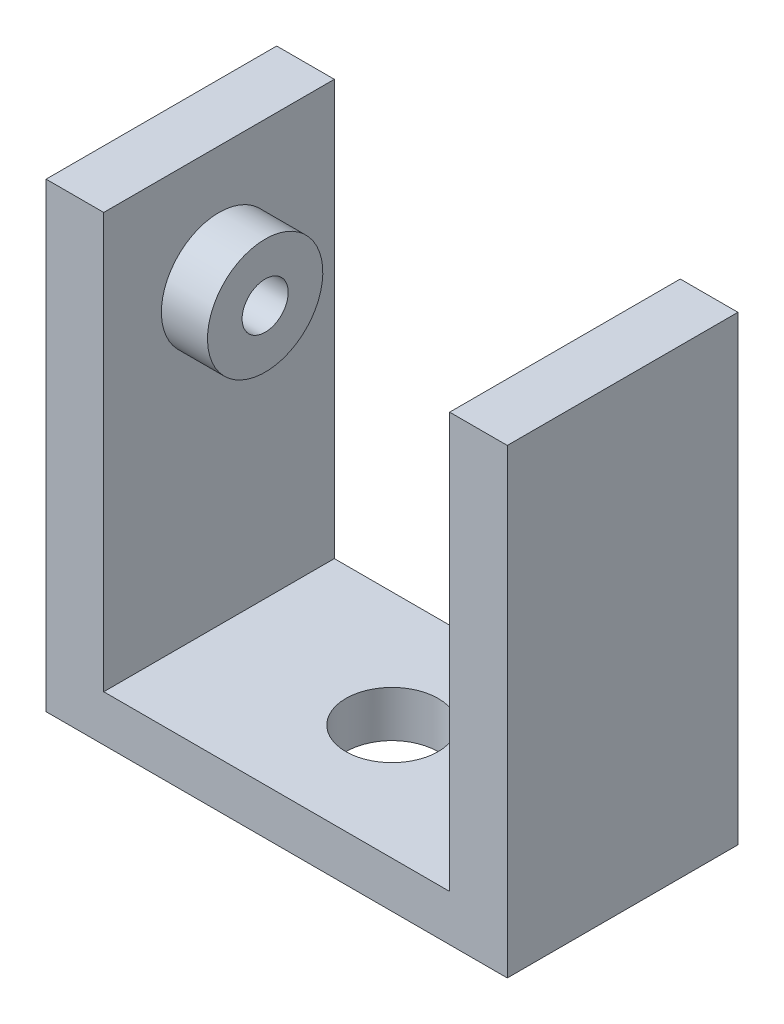
ISO-10303-21;
HEADER;
FILE_DESCRIPTION(('STEP AP214'),'2;1');
FILE_NAME('part.step','',(''),(''),'','','');
FILE_SCHEMA(('AUTOMOTIVE_DESIGN { 1 0 10303 214 1 1 1 1 }'));
ENDSEC;
DATA;
#1=APPLICATION_CONTEXT('core data for automotive mechanical design processes');
#2=APPLICATION_PROTOCOL_DEFINITION('international standard','automotive_design',2000,#1);
#3=PRODUCT_CONTEXT('',#1,'mechanical');
#4=PRODUCT('Part','Part','',(#3));
#5=PRODUCT_RELATED_PRODUCT_CATEGORY('part','',(#4));
#6=PRODUCT_DEFINITION_FORMATION('','',#4);
#7=PRODUCT_DEFINITION_CONTEXT('part definition',#1,'design');
#8=PRODUCT_DEFINITION('design','',#6,#7);
#9=PRODUCT_DEFINITION_SHAPE('','',#8);
#10=(LENGTH_UNIT() NAMED_UNIT(*) SI_UNIT(.MILLI.,.METRE.));
#11=(NAMED_UNIT(*) PLANE_ANGLE_UNIT() SI_UNIT($,.RADIAN.));
#12=(NAMED_UNIT(*) SI_UNIT($,.STERADIAN.) SOLID_ANGLE_UNIT());
#13=UNCERTAINTY_MEASURE_WITH_UNIT(LENGTH_MEASURE(1.E-05),#10,'distance_accuracy_value','');
#14=(GEOMETRIC_REPRESENTATION_CONTEXT(3) GLOBAL_UNCERTAINTY_ASSIGNED_CONTEXT((#13)) GLOBAL_UNIT_ASSIGNED_CONTEXT((#10,
#11,#12)) REPRESENTATION_CONTEXT('',''));
#15=CARTESIAN_POINT('',(0.,0.,0.));
#16=DIRECTION('',(0.,0.,1.));
#17=DIRECTION('',(1.,0.,0.));
#18=AXIS2_PLACEMENT_3D('',#15,#16,#17);
#19=CARTESIAN_POINT('',(0.,40.,0.));
#20=DIRECTION('',(0.,1.,0.));
#21=DIRECTION('',(0.,0.,1.));
#22=AXIS2_PLACEMENT_3D('',#19,#20,#21);
#23=PLANE('',#22);
#24=DIRECTION('',(1.,0.,0.));
#25=VECTOR('',#24,1.);
#26=CARTESIAN_POINT('',(-20.,40.,10.));
#27=LINE('',#26,#25);
#28=CARTESIAN_POINT('',(-20.,40.,10.));
#29=VERTEX_POINT('',#28);
#30=CARTESIAN_POINT('',(-15.,40.,10.));
#31=VERTEX_POINT('',#30);
#32=EDGE_CURVE('E115',#29,#31,#27,.T.);
#33=ORIENTED_EDGE('',*,*,#32,.T.);
#34=DIRECTION('',(0.,0.,-1.));
#35=VECTOR('',#34,1.);
#36=CARTESIAN_POINT('',(-15.,40.,110.));
#37=LINE('',#36,#35);
#38=CARTESIAN_POINT('',(-15.,40.,-10.));
#39=VERTEX_POINT('',#38);
#40=EDGE_CURVE('E368',#31,#39,#37,.T.);
#41=ORIENTED_EDGE('',*,*,#40,.T.);
#42=DIRECTION('',(-1.,0.,0.));
#43=VECTOR('',#42,1.);
#44=CARTESIAN_POINT('',(-20.,40.,-10.));
#45=LINE('',#44,#43);
#46=CARTESIAN_POINT('',(-20.,40.,-10.));
#47=VERTEX_POINT('',#46);
#48=EDGE_CURVE('E382',#39,#47,#45,.T.);
#49=ORIENTED_EDGE('',*,*,#48,.T.);
#50=DIRECTION('',(0.,0.,1.));
#51=VECTOR('',#50,1.);
#52=CARTESIAN_POINT('',(-20.,40.,-10.));
#53=LINE('',#52,#51);
#54=EDGE_CURVE('E116',#47,#29,#53,.T.);
#55=ORIENTED_EDGE('',*,*,#54,.T.);
#56=EDGE_LOOP('',(#33,#41,#49,#55));
#57=FACE_BOUND('',#56,.T.);
#58=ADVANCED_FACE('F39',(#57),#23,.T.);
#59=CARTESIAN_POINT('',(-20.,40.,-10.));
#60=DIRECTION('',(0.,0.,1.));
#61=DIRECTION('',(1.,0.,0.));
#62=AXIS2_PLACEMENT_3D('',#59,#60,#61);
#63=PLANE('',#62);
#64=DIRECTION('',(0.,1.,0.));
#65=VECTOR('',#64,1.);
#66=CARTESIAN_POINT('',(-15.,40.,-10.));
#67=LINE('',#66,#65);
#68=CARTESIAN_POINT('',(-15.,4.,-10.));
#69=VERTEX_POINT('',#68);
#70=EDGE_CURVE('E55',#69,#39,#67,.T.);
#71=ORIENTED_EDGE('',*,*,#70,.F.);
#72=DIRECTION('',(-1.,0.,0.));
#73=VECTOR('',#72,1.);
#74=CARTESIAN_POINT('',(-20.,4.,-10.));
#75=LINE('',#74,#73);
#76=CARTESIAN_POINT('',(15.,4.,-10.));
#77=VERTEX_POINT('',#76);
#78=EDGE_CURVE('E59',#77,#69,#75,.T.);
#79=ORIENTED_EDGE('',*,*,#78,.F.);
#80=DIRECTION('',(0.,-1.,0.));
#81=VECTOR('',#80,1.);
#82=CARTESIAN_POINT('',(15.,40.,-10.));
#83=LINE('',#82,#81);
#84=CARTESIAN_POINT('',(15.,40.,-10.));
#85=VERTEX_POINT('',#84);
#86=EDGE_CURVE('E371',#85,#77,#83,.T.);
#87=ORIENTED_EDGE('',*,*,#86,.F.);
#88=CARTESIAN_POINT('',(20.,40.,-10.));
#89=VERTEX_POINT('',#88);
#90=EDGE_CURVE('E122',#89,#85,#45,.T.);
#91=ORIENTED_EDGE('',*,*,#90,.F.);
#92=DIRECTION('',(0.,-1.,0.));
#93=VECTOR('',#92,1.);
#94=CARTESIAN_POINT('',(20.,40.,-10.));
#95=LINE('',#94,#93);
#96=CARTESIAN_POINT('',(20.,0.,-10.));
#97=VERTEX_POINT('',#96);
#98=EDGE_CURVE('E133',#89,#97,#95,.T.);
#99=ORIENTED_EDGE('',*,*,#98,.T.);
#100=DIRECTION('',(-1.,0.,0.));
#101=VECTOR('',#100,1.);
#102=CARTESIAN_POINT('',(-20.,0.,-10.));
#103=LINE('',#102,#101);
#104=CARTESIAN_POINT('',(-20.,0.,-10.));
#105=VERTEX_POINT('',#104);
#106=EDGE_CURVE('E392',#97,#105,#103,.T.);
#107=ORIENTED_EDGE('',*,*,#106,.T.);
#108=DIRECTION('',(0.,-1.,0.));
#109=VECTOR('',#108,1.);
#110=CARTESIAN_POINT('',(-20.,40.,-10.));
#111=LINE('',#110,#109);
#112=EDGE_CURVE('E140',#47,#105,#111,.T.);
#113=ORIENTED_EDGE('',*,*,#112,.F.);
#114=ORIENTED_EDGE('',*,*,#48,.F.);
#115=EDGE_LOOP('',(#71,#79,#87,#91,#99,#107,#113,#114));
#116=FACE_BOUND('',#115,.T.);
#117=ADVANCED_FACE('F179',(#116),#63,.F.);
#118=CARTESIAN_POINT('',(-20.,40.,10.));
#119=DIRECTION('',(0.,0.,-1.));
#120=DIRECTION('',(-1.,0.,0.));
#121=AXIS2_PLACEMENT_3D('',#118,#119,#120);
#122=PLANE('',#121);
#123=DIRECTION('',(0.,-1.,0.));
#124=VECTOR('',#123,1.);
#125=CARTESIAN_POINT('',(-15.,40.,10.));
#126=LINE('',#125,#124);
#127=CARTESIAN_POINT('',(-15.,4.,10.));
#128=VERTEX_POINT('',#127);
#129=EDGE_CURVE('E137',#31,#128,#126,.T.);
#130=ORIENTED_EDGE('',*,*,#129,.F.);
#131=ORIENTED_EDGE('',*,*,#32,.F.);
#132=DIRECTION('',(0.,-1.,0.));
#133=VECTOR('',#132,1.);
#134=CARTESIAN_POINT('',(-20.,40.,10.));
#135=LINE('',#134,#133);
#136=CARTESIAN_POINT('',(-20.,0.,10.));
#137=VERTEX_POINT('',#136);
#138=EDGE_CURVE('E402',#29,#137,#135,.T.);
#139=ORIENTED_EDGE('',*,*,#138,.T.);
#140=DIRECTION('',(1.,0.,0.));
#141=VECTOR('',#140,1.);
#142=CARTESIAN_POINT('',(-20.,0.,10.));
#143=LINE('',#142,#141);
#144=CARTESIAN_POINT('',(20.,0.,10.));
#145=VERTEX_POINT('',#144);
#146=EDGE_CURVE('E383',#137,#145,#143,.T.);
#147=ORIENTED_EDGE('',*,*,#146,.T.);
#148=DIRECTION('',(0.,-1.,0.));
#149=VECTOR('',#148,1.);
#150=CARTESIAN_POINT('',(20.,40.,10.));
#151=LINE('',#150,#149);
#152=CARTESIAN_POINT('',(20.,40.,10.));
#153=VERTEX_POINT('',#152);
#154=EDGE_CURVE('E110',#153,#145,#151,.T.);
#155=ORIENTED_EDGE('',*,*,#154,.F.);
#156=CARTESIAN_POINT('',(15.,40.,9.99999999999999));
#157=VERTEX_POINT('',#156);
#158=EDGE_CURVE('E103',#157,#153,#27,.T.);
#159=ORIENTED_EDGE('',*,*,#158,.F.);
#160=DIRECTION('',(0.,1.,0.));
#161=VECTOR('',#160,1.);
#162=CARTESIAN_POINT('',(15.,40.,10.));
#163=LINE('',#162,#161);
#164=CARTESIAN_POINT('',(15.,4.,10.));
#165=VERTEX_POINT('',#164);
#166=EDGE_CURVE('E107',#165,#157,#163,.T.);
#167=ORIENTED_EDGE('',*,*,#166,.F.);
#168=DIRECTION('',(1.,0.,0.));
#169=VECTOR('',#168,1.);
#170=CARTESIAN_POINT('',(-20.,4.,10.));
#171=LINE('',#170,#169);
#172=EDGE_CURVE('E132',#128,#165,#171,.T.);
#173=ORIENTED_EDGE('',*,*,#172,.F.);
#174=EDGE_LOOP('',(#130,#131,#139,#147,#155,#159,#167,#173));
#175=FACE_BOUND('',#174,.T.);
#176=ADVANCED_FACE('F105',(#175),#122,.F.);
#177=CARTESIAN_POINT('',(20.,40.,-10.));
#178=DIRECTION('',(-1.,0.,0.));
#179=DIRECTION('',(0.,0.,1.));
#180=AXIS2_PLACEMENT_3D('',#177,#178,#179);
#181=PLANE('',#180);
#182=DIRECTION('',(0.,0.,-1.));
#183=VECTOR('',#182,1.);
#184=CARTESIAN_POINT('',(20.,0.,-10.));
#185=LINE('',#184,#183);
#186=EDGE_CURVE('E378',#145,#97,#185,.T.);
#187=ORIENTED_EDGE('',*,*,#186,.T.);
#188=ORIENTED_EDGE('',*,*,#98,.F.);
#189=DIRECTION('',(0.,0.,-1.));
#190=VECTOR('',#189,1.);
#191=CARTESIAN_POINT('',(20.,40.,-10.));
#192=LINE('',#191,#190);
#193=EDGE_CURVE('E379',#153,#89,#192,.T.);
#194=ORIENTED_EDGE('',*,*,#193,.F.);
#195=ORIENTED_EDGE('',*,*,#154,.T.);
#196=EDGE_LOOP('',(#187,#188,#194,#195));
#197=FACE_BOUND('',#196,.T.);
#198=ADVANCED_FACE('F41',(#197),#181,.F.);
#199=CARTESIAN_POINT('',(-20.,40.,-10.));
#200=DIRECTION('',(1.,0.,0.));
#201=DIRECTION('',(0.,0.,-1.));
#202=AXIS2_PLACEMENT_3D('',#199,#200,#201);
#203=PLANE('',#202);
#204=DIRECTION('',(0.,0.,1.));
#205=VECTOR('',#204,1.);
#206=CARTESIAN_POINT('',(-20.,0.,-10.));
#207=LINE('',#206,#205);
#208=EDGE_CURVE('E395',#105,#137,#207,.T.);
#209=ORIENTED_EDGE('',*,*,#208,.T.);
#210=ORIENTED_EDGE('',*,*,#138,.F.);
#211=ORIENTED_EDGE('',*,*,#54,.F.);
#212=ORIENTED_EDGE('',*,*,#112,.T.);
#213=EDGE_LOOP('',(#209,#210,#211,#212));
#214=FACE_BOUND('',#213,.T.);
#215=ADVANCED_FACE('F187',(#214),#203,.F.);
#216=DIRECTION('',(0.,0.,-1.));
#217=VECTOR('',#216,1.);
#218=CARTESIAN_POINT('',(15.,40.,110.));
#219=LINE('',#218,#217);
#220=EDGE_CURVE('E120',#157,#85,#219,.T.);
#221=ORIENTED_EDGE('',*,*,#220,.F.);
#222=ORIENTED_EDGE('',*,*,#158,.T.);
#223=ORIENTED_EDGE('',*,*,#193,.T.);
#224=ORIENTED_EDGE('',*,*,#90,.T.);
#225=EDGE_LOOP('',(#221,#222,#223,#224));
#226=FACE_BOUND('',#225,.T.);
#227=ADVANCED_FACE('F121',(#226),#23,.T.);
#228=CARTESIAN_POINT('',(0.,0.,0.));
#229=DIRECTION('',(0.,1.,0.));
#230=DIRECTION('',(0.,0.,1.));
#231=AXIS2_PLACEMENT_3D('',#228,#229,#230);
#232=PLANE('',#231);
#233=CARTESIAN_POINT('',(0.,0.,0.));
#234=DIRECTION('',(0.,-1.,0.));
#235=DIRECTION('',(0.,0.,-1.));
#236=AXIS2_PLACEMENT_3D('',#233,#234,#235);
#237=CIRCLE('',#236,4.);
#238=CARTESIAN_POINT('',(0.,0.,-4.));
#239=VERTEX_POINT('',#238);
#240=EDGE_CURVE('E150',#239,#239,#237,.T.);
#241=ORIENTED_EDGE('',*,*,#240,.F.);
#242=EDGE_LOOP('',(#241));
#243=FACE_BOUND('',#242,.T.);
#244=ORIENTED_EDGE('',*,*,#186,.F.);
#245=ORIENTED_EDGE('',*,*,#146,.F.);
#246=ORIENTED_EDGE('',*,*,#208,.F.);
#247=ORIENTED_EDGE('',*,*,#106,.F.);
#248=EDGE_LOOP('',(#244,#245,#246,#247));
#249=FACE_BOUND('',#248,.T.);
#250=ADVANCED_FACE('F176',(#243,#249),#232,.F.);
#251=CARTESIAN_POINT('',(-15.,40.,110.));
#252=DIRECTION('',(1.,0.,0.));
#253=DIRECTION('',(0.,1.,0.));
#254=AXIS2_PLACEMENT_3D('',#251,#252,#253);
#255=PLANE('',#254);
#256=CARTESIAN_POINT('',(-15.,30.,0.));
#257=DIRECTION('',(1.,0.,0.));
#258=DIRECTION('',(0.,1.,0.));
#259=AXIS2_PLACEMENT_3D('',#256,#257,#258);
#260=CIRCLE('',#259,5.);
#261=CARTESIAN_POINT('',(-15.,35.,0.));
#262=VERTEX_POINT('',#261);
#263=EDGE_CURVE('E352',#262,#262,#260,.T.);
#264=ORIENTED_EDGE('',*,*,#263,.F.);
#265=EDGE_LOOP('',(#264));
#266=FACE_BOUND('',#265,.T.);
#267=DIRECTION('',(0.,0.,-1.));
#268=VECTOR('',#267,1.);
#269=CARTESIAN_POINT('',(-15.,4.,110.));
#270=LINE('',#269,#268);
#271=EDGE_CURVE('E125',#128,#69,#270,.T.);
#272=ORIENTED_EDGE('',*,*,#271,.T.);
#273=ORIENTED_EDGE('',*,*,#70,.T.);
#274=ORIENTED_EDGE('',*,*,#40,.F.);
#275=ORIENTED_EDGE('',*,*,#129,.T.);
#276=EDGE_LOOP('',(#272,#273,#274,#275));
#277=FACE_BOUND('',#276,.T.);
#278=ADVANCED_FACE('F161',(#266,#277),#255,.T.);
#279=CARTESIAN_POINT('',(-15.,4.,110.));
#280=DIRECTION('',(0.,1.,0.));
#281=DIRECTION('',(0.,0.,1.));
#282=AXIS2_PLACEMENT_3D('',#279,#280,#281);
#283=PLANE('',#282);
#284=CARTESIAN_POINT('',(0.,4.,0.));
#285=DIRECTION('',(0.,1.,0.));
#286=DIRECTION('',(0.,0.,1.));
#287=AXIS2_PLACEMENT_3D('',#284,#285,#286);
#288=CIRCLE('',#287,4.);
#289=CARTESIAN_POINT('',(0.,4.,4.));
#290=VERTEX_POINT('',#289);
#291=EDGE_CURVE('E147',#290,#290,#288,.T.);
#292=ORIENTED_EDGE('',*,*,#291,.F.);
#293=EDGE_LOOP('',(#292));
#294=FACE_BOUND('',#293,.T.);
#295=DIRECTION('',(0.,0.,-1.));
#296=VECTOR('',#295,1.);
#297=CARTESIAN_POINT('',(15.,4.,110.));
#298=LINE('',#297,#296);
#299=EDGE_CURVE('E126',#165,#77,#298,.T.);
#300=ORIENTED_EDGE('',*,*,#299,.T.);
#301=ORIENTED_EDGE('',*,*,#78,.T.);
#302=ORIENTED_EDGE('',*,*,#271,.F.);
#303=ORIENTED_EDGE('',*,*,#172,.T.);
#304=EDGE_LOOP('',(#300,#301,#302,#303));
#305=FACE_BOUND('',#304,.T.);
#306=ADVANCED_FACE('F175',(#294,#305),#283,.T.);
#307=CARTESIAN_POINT('',(15.,4.,110.));
#308=DIRECTION('',(-1.,0.,0.));
#309=DIRECTION('',(0.,-1.,0.));
#310=AXIS2_PLACEMENT_3D('',#307,#308,#309);
#311=PLANE('',#310);
#312=CARTESIAN_POINT('',(15.,30.,0.));
#313=DIRECTION('',(-1.,0.,0.));
#314=DIRECTION('',(0.,-1.,0.));
#315=AXIS2_PLACEMENT_3D('',#312,#313,#314);
#316=CIRCLE('',#315,5.);
#317=CARTESIAN_POINT('',(15.,25.,0.));
#318=VERTEX_POINT('',#317);
#319=EDGE_CURVE('E11',#318,#318,#316,.T.);
#320=ORIENTED_EDGE('',*,*,#319,.F.);
#321=EDGE_LOOP('',(#320));
#322=FACE_BOUND('',#321,.T.);
#323=ORIENTED_EDGE('',*,*,#220,.T.);
#324=ORIENTED_EDGE('',*,*,#86,.T.);
#325=ORIENTED_EDGE('',*,*,#299,.F.);
#326=ORIENTED_EDGE('',*,*,#166,.T.);
#327=EDGE_LOOP('',(#323,#324,#325,#326));
#328=FACE_BOUND('',#327,.T.);
#329=ADVANCED_FACE('F129',(#322,#328),#311,.T.);
#330=CARTESIAN_POINT('',(0.,40.,0.));
#331=DIRECTION('',(0.,-1.,0.));
#332=DIRECTION('',(0.,0.,-1.));
#333=AXIS2_PLACEMENT_3D('',#330,#331,#332);
#334=CYLINDRICAL_SURFACE('',#333,4.);
#335=ORIENTED_EDGE('',*,*,#291,.T.);
#336=EDGE_LOOP('',(#335));
#337=FACE_BOUND('',#336,.T.);
#338=ORIENTED_EDGE('',*,*,#240,.T.);
#339=EDGE_LOOP('',(#338));
#340=FACE_BOUND('',#339,.T.);
#341=ADVANCED_FACE('F249',(#337,#340),#334,.F.);
#342=CARTESIAN_POINT('',(-11.,30.,0.));
#343=DIRECTION('',(1.,0.,0.));
#344=DIRECTION('',(0.,1.,0.));
#345=AXIS2_PLACEMENT_3D('',#342,#343,#344);
#346=PLANE('',#345);
#347=CARTESIAN_POINT('',(-11.,30.,0.));
#348=DIRECTION('',(1.,0.,0.));
#349=DIRECTION('',(0.,1.,0.));
#350=AXIS2_PLACEMENT_3D('',#347,#348,#349);
#351=CIRCLE('',#350,5.);
#352=CARTESIAN_POINT('',(-11.,35.,0.));
#353=VERTEX_POINT('',#352);
#354=EDGE_CURVE('E353',#353,#353,#351,.T.);
#355=ORIENTED_EDGE('',*,*,#354,.T.);
#356=EDGE_LOOP('',(#355));
#357=FACE_BOUND('',#356,.T.);
#358=CARTESIAN_POINT('',(-11.,30.,0.));
#359=DIRECTION('',(1.,0.,0.));
#360=DIRECTION('',(0.,1.,0.));
#361=AXIS2_PLACEMENT_3D('',#358,#359,#360);
#362=CIRCLE('',#361,2.);
#363=CARTESIAN_POINT('',(-11.,32.,0.));
#364=VERTEX_POINT('',#363);
#365=EDGE_CURVE('E348',#364,#364,#362,.T.);
#366=ORIENTED_EDGE('',*,*,#365,.F.);
#367=EDGE_LOOP('',(#366));
#368=FACE_BOUND('',#367,.T.);
#369=ADVANCED_FACE('F254',(#357,#368),#346,.T.);
#370=CARTESIAN_POINT('',(-11.,30.,0.));
#371=DIRECTION('',(-1.,0.,0.));
#372=DIRECTION('',(0.,-1.,0.));
#373=AXIS2_PLACEMENT_3D('',#370,#371,#372);
#374=CYLINDRICAL_SURFACE('',#373,5.);
#375=ORIENTED_EDGE('',*,*,#354,.F.);
#376=EDGE_LOOP('',(#375));
#377=FACE_BOUND('',#376,.T.);
#378=ORIENTED_EDGE('',*,*,#263,.T.);
#379=EDGE_LOOP('',(#378));
#380=FACE_BOUND('',#379,.T.);
#381=ADVANCED_FACE('F169',(#377,#380),#374,.T.);
#382=CARTESIAN_POINT('',(-11.,30.,0.));
#383=DIRECTION('',(-1.,0.,0.));
#384=DIRECTION('',(0.,-1.,0.));
#385=AXIS2_PLACEMENT_3D('',#382,#383,#384);
#386=CYLINDRICAL_SURFACE('',#385,2.);
#387=ORIENTED_EDGE('',*,*,#365,.T.);
#388=EDGE_LOOP('',(#387));
#389=FACE_BOUND('',#388,.T.);
#390=CARTESIAN_POINT('',(-15.,30.,0.));
#391=DIRECTION('',(1.,0.,0.));
#392=DIRECTION('',(0.,1.,0.));
#393=AXIS2_PLACEMENT_3D('',#390,#391,#392);
#394=CIRCLE('',#393,2.);
#395=CARTESIAN_POINT('',(-15.,32.,0.));
#396=VERTEX_POINT('',#395);
#397=EDGE_CURVE('E48',#396,#396,#394,.F.);
#398=ORIENTED_EDGE('',*,*,#397,.T.);
#399=EDGE_LOOP('',(#398));
#400=FACE_BOUND('',#399,.T.);
#401=ADVANCED_FACE('F155',(#389,#400),#386,.F.);
#402=ORIENTED_EDGE('',*,*,#397,.F.);
#403=EDGE_LOOP('',(#402));
#404=FACE_BOUND('',#403,.T.);
#405=ADVANCED_FACE('F157',(#404),#255,.T.);
#406=CARTESIAN_POINT('',(11.,30.,0.));
#407=DIRECTION('',(1.,0.,0.));
#408=DIRECTION('',(0.,1.,0.));
#409=AXIS2_PLACEMENT_3D('',#406,#407,#408);
#410=CYLINDRICAL_SURFACE('',#409,5.);
#411=CARTESIAN_POINT('',(11.,30.,0.));
#412=DIRECTION('',(1.,0.,0.));
#413=DIRECTION('',(0.,1.,0.));
#414=AXIS2_PLACEMENT_3D('',#411,#412,#413);
#415=CIRCLE('',#414,5.);
#416=CARTESIAN_POINT('',(11.,35.,0.));
#417=VERTEX_POINT('',#416);
#418=EDGE_CURVE('E342',#417,#417,#415,.T.);
#419=ORIENTED_EDGE('',*,*,#418,.T.);
#420=EDGE_LOOP('',(#419));
#421=FACE_BOUND('',#420,.T.);
#422=ORIENTED_EDGE('',*,*,#319,.T.);
#423=EDGE_LOOP('',(#422));
#424=FACE_BOUND('',#423,.T.);
#425=ADVANCED_FACE('F159',(#421,#424),#410,.T.);
#426=CARTESIAN_POINT('',(11.,30.,0.));
#427=DIRECTION('',(-1.,0.,0.));
#428=DIRECTION('',(0.,1.,0.));
#429=AXIS2_PLACEMENT_3D('',#426,#427,#428);
#430=PLANE('',#429);
#431=CARTESIAN_POINT('',(11.,30.,0.));
#432=DIRECTION('',(1.,0.,0.));
#433=DIRECTION('',(0.,1.,0.));
#434=AXIS2_PLACEMENT_3D('',#431,#432,#433);
#435=CIRCLE('',#434,2.);
#436=CARTESIAN_POINT('',(11.,32.,0.));
#437=VERTEX_POINT('',#436);
#438=EDGE_CURVE('E338',#437,#437,#435,.T.);
#439=ORIENTED_EDGE('',*,*,#438,.T.);
#440=EDGE_LOOP('',(#439));
#441=FACE_BOUND('',#440,.T.);
#442=ORIENTED_EDGE('',*,*,#418,.F.);
#443=EDGE_LOOP('',(#442));
#444=FACE_BOUND('',#443,.T.);
#445=ADVANCED_FACE('F166',(#441,#444),#430,.T.);
#446=CARTESIAN_POINT('',(11.,30.,0.));
#447=DIRECTION('',(1.,0.,0.));
#448=DIRECTION('',(0.,1.,0.));
#449=AXIS2_PLACEMENT_3D('',#446,#447,#448);
#450=CYLINDRICAL_SURFACE('',#449,2.);
#451=ORIENTED_EDGE('',*,*,#438,.F.);
#452=EDGE_LOOP('',(#451));
#453=FACE_BOUND('',#452,.T.);
#454=CARTESIAN_POINT('',(15.,30.,0.));
#455=DIRECTION('',(1.,0.,0.));
#456=DIRECTION('',(0.,1.,0.));
#457=AXIS2_PLACEMENT_3D('',#454,#455,#456);
#458=CIRCLE('',#457,2.);
#459=CARTESIAN_POINT('',(15.,32.,0.));
#460=VERTEX_POINT('',#459);
#461=EDGE_CURVE('E335',#460,#460,#458,.T.);
#462=ORIENTED_EDGE('',*,*,#461,.T.);
#463=EDGE_LOOP('',(#462));
#464=FACE_BOUND('',#463,.T.);
#465=ADVANCED_FACE('F312',(#453,#464),#450,.F.);
#466=ORIENTED_EDGE('',*,*,#461,.F.);
#467=EDGE_LOOP('',(#466));
#468=FACE_BOUND('',#467,.T.);
#469=ADVANCED_FACE('F298',(#468),#311,.T.);
#470=CLOSED_SHELL('',(#58,#117,#176,#198,#215,#227,#250,#278,#306,#329,#341,#369,#381,#401,#405,
#425,#445,#465,#469));
#471=MANIFOLD_SOLID_BREP('B2',#470);
#472=ADVANCED_BREP_SHAPE_REPRESENTATION('',(#18,#471),#14);
#473=SHAPE_DEFINITION_REPRESENTATION(#9,#472);
ENDSEC;
END-ISO-10303-21;
